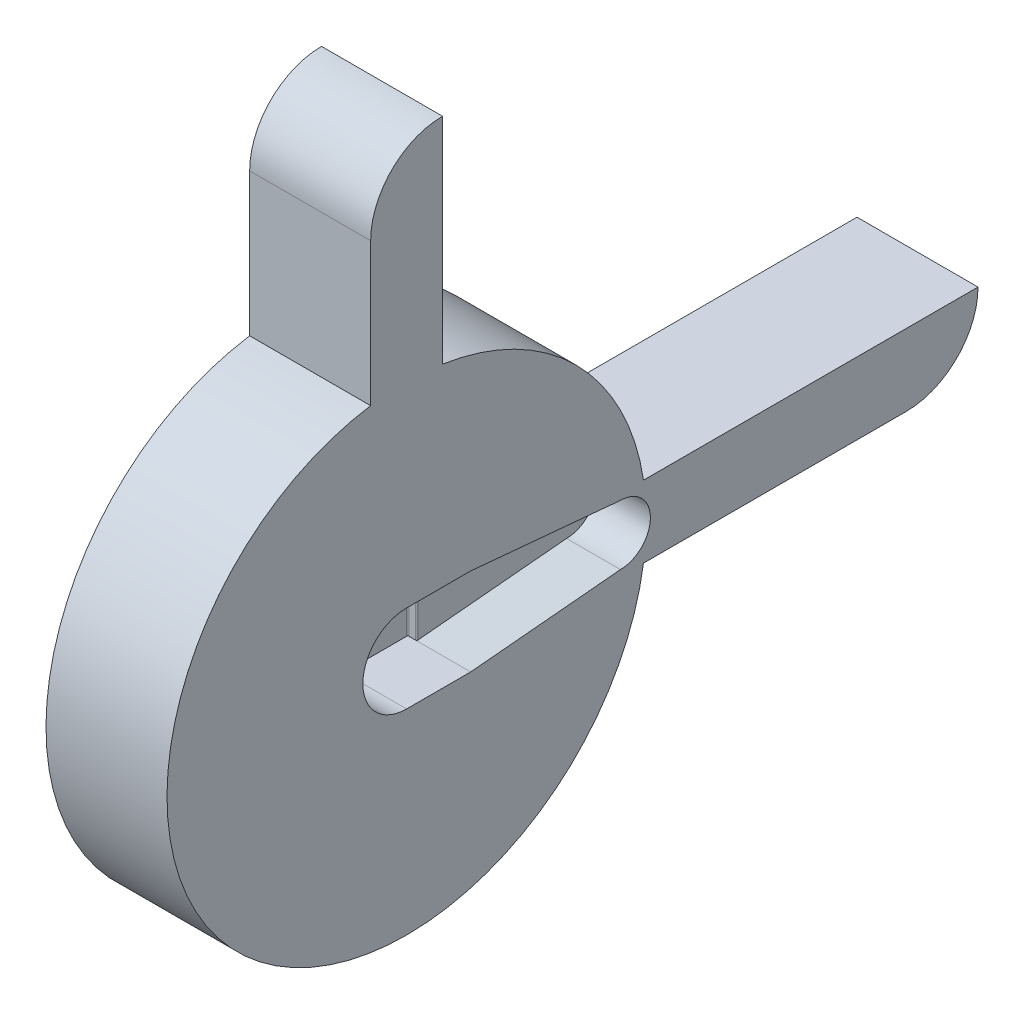
ISO-10303-21;
HEADER;
FILE_DESCRIPTION(('STEP AP214'),'2;1');
FILE_NAME('part.step','',(''),(''),'','','');
FILE_SCHEMA(('AUTOMOTIVE_DESIGN { 1 0 10303 214 1 1 1 1 }'));
ENDSEC;
DATA;
#1=APPLICATION_CONTEXT('core data for automotive mechanical design processes');
#2=APPLICATION_PROTOCOL_DEFINITION('international standard','automotive_design',2000,#1);
#3=PRODUCT_CONTEXT('',#1,'mechanical');
#4=PRODUCT('Part','Part','',(#3));
#5=PRODUCT_RELATED_PRODUCT_CATEGORY('part','',(#4));
#6=PRODUCT_DEFINITION_FORMATION('','',#4);
#7=PRODUCT_DEFINITION_CONTEXT('part definition',#1,'design');
#8=PRODUCT_DEFINITION('design','',#6,#7);
#9=PRODUCT_DEFINITION_SHAPE('','',#8);
#10=(LENGTH_UNIT() NAMED_UNIT(*) SI_UNIT(.MILLI.,.METRE.));
#11=(NAMED_UNIT(*) PLANE_ANGLE_UNIT() SI_UNIT($,.RADIAN.));
#12=(NAMED_UNIT(*) SI_UNIT($,.STERADIAN.) SOLID_ANGLE_UNIT());
#13=UNCERTAINTY_MEASURE_WITH_UNIT(LENGTH_MEASURE(1.E-05),#10,'distance_accuracy_value','');
#14=(GEOMETRIC_REPRESENTATION_CONTEXT(3) GLOBAL_UNCERTAINTY_ASSIGNED_CONTEXT((#13)) GLOBAL_UNIT_ASSIGNED_CONTEXT((#10,
#11,#12)) REPRESENTATION_CONTEXT('',''));
#15=CARTESIAN_POINT('',(0.,0.,0.));
#16=DIRECTION('',(0.,0.,1.));
#17=DIRECTION('',(1.,0.,0.));
#18=AXIS2_PLACEMENT_3D('',#15,#16,#17);
#19=CARTESIAN_POINT('',(4.75,0.,13.1498935704629));
#20=DIRECTION('',(0.,0.,1.));
#21=DIRECTION('',(1.,0.,0.));
#22=AXIS2_PLACEMENT_3D('',#19,#20,#21);
#23=PLANE('',#22);
#24=DIRECTION('',(1.,0.,0.));
#25=VECTOR('',#24,1.);
#26=CARTESIAN_POINT('',(4.75,58.3930013871417,13.1498935704629));
#27=LINE('',#26,#25);
#28=CARTESIAN_POINT('',(4.85,58.3930013871417,13.1498935704629));
#29=VERTEX_POINT('',#28);
#30=CARTESIAN_POINT('',(5.4,58.3930013871417,13.1498935704629));
#31=VERTEX_POINT('',#30);
#32=EDGE_CURVE('E239',#29,#31,#27,.T.);
#33=ORIENTED_EDGE('',*,*,#32,.T.);
#34=DIRECTION('',(0.,-1.,0.));
#35=VECTOR('',#34,1.);
#36=CARTESIAN_POINT('',(5.4,0.,13.1498935704629));
#37=LINE('',#36,#35);
#38=CARTESIAN_POINT('',(5.4,65.6930013871417,13.1498935704629));
#39=VERTEX_POINT('',#38);
#40=EDGE_CURVE('E292',#31,#39,#37,.F.);
#41=ORIENTED_EDGE('',*,*,#40,.T.);
#42=DIRECTION('',(1.,0.,0.));
#43=VECTOR('',#42,1.);
#44=CARTESIAN_POINT('',(4.75,65.6930013871417,13.1498935704629));
#45=LINE('',#44,#43);
#46=CARTESIAN_POINT('',(4.85,65.6930013871417,13.1498935704629));
#47=VERTEX_POINT('',#46);
#48=EDGE_CURVE('E235',#47,#39,#45,.T.);
#49=ORIENTED_EDGE('',*,*,#48,.F.);
#50=DIRECTION('',(0.,-1.,0.));
#51=VECTOR('',#50,1.);
#52=CARTESIAN_POINT('',(4.85,58.3930013871417,13.1498935704629));
#53=LINE('',#52,#51);
#54=EDGE_CURVE('E289',#47,#29,#53,.T.);
#55=ORIENTED_EDGE('',*,*,#54,.T.);
#56=EDGE_LOOP('',(#33,#41,#49,#55));
#57=FACE_BOUND('',#56,.T.);
#58=ADVANCED_FACE('F47',(#57),#23,.T.);
#59=CARTESIAN_POINT('',(10.,62.0430013861929,18.4998935714117));
#60=DIRECTION('',(1.,0.,0.));
#61=DIRECTION('',(0.,1.,0.));
#62=AXIS2_PLACEMENT_3D('',#59,#60,#61);
#63=PLANE('',#62);
#64=DIRECTION('',(0.,0.0916131102511358,-0.995794676642787));
#65=VECTOR('',#64,1.);
#66=CARTESIAN_POINT('',(10.,59.1025476324631,5.43743438218657));
#67=LINE('',#66,#65);
#68=CARTESIAN_POINT('',(10.,58.3930013871417,13.1498935704629));
#69=VERTEX_POINT('',#68);
#70=CARTESIAN_POINT('',(10.,59.5430013871417,0.649893570462901));
#71=VERTEX_POINT('',#70);
#72=EDGE_CURVE('E178',#69,#71,#67,.T.);
#73=ORIENTED_EDGE('',*,*,#72,.F.);
#74=DIRECTION('',(0.,0.,1.));
#75=VECTOR('',#74,1.);
#76=CARTESIAN_POINT('',(10.,58.3930013871417,0.));
#77=LINE('',#76,#75);
#78=CARTESIAN_POINT('',(10.,58.3930013871417,18.4998935704629));
#79=VERTEX_POINT('',#78);
#80=EDGE_CURVE('E219',#69,#79,#77,.T.);
#81=ORIENTED_EDGE('',*,*,#80,.T.);
#82=CARTESIAN_POINT('',(10.,62.0430013871417,18.4998935704629));
#83=DIRECTION('',(1.,0.,0.));
#84=DIRECTION('',(0.,0.,-1.));
#85=AXIS2_PLACEMENT_3D('',#82,#83,#84);
#86=CIRCLE('',#85,3.65);
#87=CARTESIAN_POINT('',(10.,65.6930013871417,18.4998935704629));
#88=VERTEX_POINT('',#87);
#89=EDGE_CURVE('E230',#88,#79,#86,.T.);
#90=ORIENTED_EDGE('',*,*,#89,.F.);
#91=DIRECTION('',(0.,0.,-1.));
#92=VECTOR('',#91,1.);
#93=CARTESIAN_POINT('',(10.,65.6930013871417,0.));
#94=LINE('',#93,#92);
#95=CARTESIAN_POINT('',(10.,65.6930013871417,13.1498935704629));
#96=VERTEX_POINT('',#95);
#97=EDGE_CURVE('E214',#88,#96,#94,.T.);
#98=ORIENTED_EDGE('',*,*,#97,.T.);
#99=DIRECTION('',(0.,-0.0916131102511363,-0.995794676642787));
#100=VECTOR('',#99,1.);
#101=CARTESIAN_POINT('',(10.,63.9420060395404,-5.88266455563771));
#102=LINE('',#101,#100);
#103=CARTESIAN_POINT('',(10.,64.5430013871417,0.649893570462901));
#104=VERTEX_POINT('',#103);
#105=EDGE_CURVE('E172',#96,#104,#102,.T.);
#106=ORIENTED_EDGE('',*,*,#105,.T.);
#107=CARTESIAN_POINT('',(10.,62.0430013871417,0.649893570462901));
#108=DIRECTION('',(1.,0.,0.));
#109=DIRECTION('',(0.,0.,-1.));
#110=AXIS2_PLACEMENT_3D('',#107,#108,#109);
#111=CIRCLE('',#110,2.5);
#112=EDGE_CURVE('E191',#71,#104,#111,.T.);
#113=ORIENTED_EDGE('',*,*,#112,.F.);
#114=EDGE_LOOP('',(#73,#81,#90,#98,#106,#113));
#115=FACE_BOUND('',#114,.T.);
#116=DIRECTION('',(0.,0.,1.));
#117=VECTOR('',#116,1.);
#118=CARTESIAN_POINT('',(10.,65.0430013871417,0.));
#119=LINE('',#118,#117);
#120=CARTESIAN_POINT('',(10.,65.0430013871417,-29.1970448862362));
#121=VERTEX_POINT('',#120);
#122=CARTESIAN_POINT('',(10.,65.0430013871417,-1.27382636282229));
#123=VERTEX_POINT('',#122);
#124=EDGE_CURVE('E254',#121,#123,#119,.T.);
#125=ORIENTED_EDGE('',*,*,#124,.T.);
#126=CARTESIAN_POINT('',(10.,62.0430013871417,18.4998935704629));
#127=DIRECTION('',(1.,0.,0.));
#128=DIRECTION('',(0.,0.,-1.));
#129=AXIS2_PLACEMENT_3D('',#126,#127,#128);
#130=CIRCLE('',#129,20.);
#131=CARTESIAN_POINT('',(10.,81.8167213204269,15.4998935704629));
#132=VERTEX_POINT('',#131);
#133=EDGE_CURVE('E196',#132,#123,#130,.F.);
#134=ORIENTED_EDGE('',*,*,#133,.F.);
#135=DIRECTION('',(0.,1.,0.));
#136=VECTOR('',#135,1.);
#137=CARTESIAN_POINT('',(10.,0.,15.4998935704629));
#138=LINE('',#137,#136);
#139=CARTESIAN_POINT('',(10.,99.7399398438408,15.4998935704629));
#140=VERTEX_POINT('',#139);
#141=EDGE_CURVE('E263',#132,#140,#138,.T.);
#142=ORIENTED_EDGE('',*,*,#141,.T.);
#143=CARTESIAN_POINT('',(10.,93.7399398438408,15.4998935704629));
#144=DIRECTION('',(1.,0.,0.));
#145=DIRECTION('',(0.,0.,-1.));
#146=AXIS2_PLACEMENT_3D('',#143,#144,#145);
#147=CIRCLE('',#146,6.);
#148=CARTESIAN_POINT('',(10.,93.7399398438408,21.4998935704629));
#149=VERTEX_POINT('',#148);
#150=EDGE_CURVE('E272',#140,#149,#147,.T.);
#151=ORIENTED_EDGE('',*,*,#150,.T.);
#152=DIRECTION('',(0.,1.,0.));
#153=VECTOR('',#152,1.);
#154=CARTESIAN_POINT('',(10.,0.,21.4998935704629));
#155=LINE('',#154,#153);
#156=CARTESIAN_POINT('',(10.,81.8167213204269,21.4998935704629));
#157=VERTEX_POINT('',#156);
#158=EDGE_CURVE('E275',#157,#149,#155,.T.);
#159=ORIENTED_EDGE('',*,*,#158,.F.);
#160=CARTESIAN_POINT('',(10.,59.0430013871417,-1.2738263628223));
#161=VERTEX_POINT('',#160);
#162=EDGE_CURVE('E205',#161,#157,#130,.F.);
#163=ORIENTED_EDGE('',*,*,#162,.F.);
#164=DIRECTION('',(0.,0.,1.));
#165=VECTOR('',#164,1.);
#166=CARTESIAN_POINT('',(10.,59.0430013871417,0.));
#167=LINE('',#166,#165);
#168=CARTESIAN_POINT('',(10.,59.0430013871417,-23.1970448862362));
#169=VERTEX_POINT('',#168);
#170=EDGE_CURVE('E257',#169,#161,#167,.T.);
#171=ORIENTED_EDGE('',*,*,#170,.F.);
#172=CARTESIAN_POINT('',(10.,65.0430013871417,-23.1970448862362));
#173=DIRECTION('',(1.,0.,0.));
#174=DIRECTION('',(0.,0.,-1.));
#175=AXIS2_PLACEMENT_3D('',#172,#173,#174);
#176=CIRCLE('',#175,6.00000000000001);
#177=EDGE_CURVE('E238',#121,#169,#176,.F.);
#178=ORIENTED_EDGE('',*,*,#177,.F.);
#179=EDGE_LOOP('',(#125,#134,#142,#151,#159,#163,#171,#178));
#180=FACE_BOUND('',#179,.T.);
#181=ADVANCED_FACE('F324',(#115,#180),#63,.T.);
#182=CARTESIAN_POINT('',(10.,62.0430013871417,18.4998935704629));
#183=DIRECTION('',(-1.,0.,0.));
#184=DIRECTION('',(0.,0.,1.));
#185=AXIS2_PLACEMENT_3D('',#182,#183,#184);
#186=CYLINDRICAL_SURFACE('',#185,1.25);
#187=CARTESIAN_POINT('',(-0.1,62.0430013871417,18.4998935704629));
#188=DIRECTION('',(-1.,0.,0.));
#189=DIRECTION('',(0.,0.,1.));
#190=AXIS2_PLACEMENT_3D('',#187,#188,#189);
#191=CIRCLE('',#190,1.25);
#192=CARTESIAN_POINT('',(-0.1,62.0430013871417,19.7498935704629));
#193=VERTEX_POINT('',#192);
#194=EDGE_CURVE('E283',#193,#193,#191,.T.);
#195=ORIENTED_EDGE('',*,*,#194,.T.);
#196=EDGE_LOOP('',(#195));
#197=FACE_BOUND('',#196,.T.);
#198=CARTESIAN_POINT('',(4.75,62.0430013871417,18.4998935704629));
#199=DIRECTION('',(1.,0.,0.));
#200=DIRECTION('',(0.,0.,-1.));
#201=AXIS2_PLACEMENT_3D('',#198,#199,#200);
#202=CIRCLE('',#201,1.25);
#203=CARTESIAN_POINT('',(4.75,62.0430013871417,17.2498935704629));
#204=VERTEX_POINT('',#203);
#205=EDGE_CURVE('E215',#204,#204,#202,.F.);
#206=ORIENTED_EDGE('',*,*,#205,.F.);
#207=EDGE_LOOP('',(#206));
#208=FACE_BOUND('',#207,.T.);
#209=ADVANCED_FACE('F343',(#197,#208),#186,.F.);
#210=CARTESIAN_POINT('',(-0.1,62.0430013861929,18.4998935714117));
#211=DIRECTION('',(1.,0.,0.));
#212=DIRECTION('',(0.,1.,0.));
#213=AXIS2_PLACEMENT_3D('',#210,#211,#212);
#214=PLANE('',#213);
#215=DIRECTION('',(0.,0.,-1.));
#216=VECTOR('',#215,1.);
#217=CARTESIAN_POINT('',(-0.100000000000003,59.0430013871417,0.));
#218=LINE('',#217,#216);
#219=CARTESIAN_POINT('',(-0.100000000000003,59.0430013871417,-1.2738263628223));
#220=VERTEX_POINT('',#219);
#221=CARTESIAN_POINT('',(-0.100000000000003,59.0430013871417,-23.1970448862362));
#222=VERTEX_POINT('',#221);
#223=EDGE_CURVE('E245',#220,#222,#218,.T.);
#224=ORIENTED_EDGE('',*,*,#223,.F.);
#225=CARTESIAN_POINT('',(-0.1,62.0430013871417,18.4998935704629));
#226=DIRECTION('',(-1.,0.,0.));
#227=DIRECTION('',(0.,0.,1.));
#228=AXIS2_PLACEMENT_3D('',#225,#226,#227);
#229=CIRCLE('',#228,20.);
#230=CARTESIAN_POINT('',(-0.100000000000003,81.8167213204269,21.4998935704629));
#231=VERTEX_POINT('',#230);
#232=EDGE_CURVE('E201',#220,#231,#229,.T.);
#233=ORIENTED_EDGE('',*,*,#232,.T.);
#234=DIRECTION('',(0.,-1.,0.));
#235=VECTOR('',#234,1.);
#236=CARTESIAN_POINT('',(-0.100000000000003,0.,21.4998935704629));
#237=LINE('',#236,#235);
#238=CARTESIAN_POINT('',(-0.100000000000003,93.7399398438408,21.4998935704629));
#239=VERTEX_POINT('',#238);
#240=EDGE_CURVE('E264',#239,#231,#237,.T.);
#241=ORIENTED_EDGE('',*,*,#240,.F.);
#242=CARTESIAN_POINT('',(-0.100000000000003,93.7399398438408,15.4998935704629));
#243=DIRECTION('',(1.,0.,0.));
#244=DIRECTION('',(0.,0.,-1.));
#245=AXIS2_PLACEMENT_3D('',#242,#243,#244);
#246=CIRCLE('',#245,6.);
#247=CARTESIAN_POINT('',(-0.100000000000003,99.7399398438408,15.4998935704629));
#248=VERTEX_POINT('',#247);
#249=EDGE_CURVE('E270',#239,#248,#246,.F.);
#250=ORIENTED_EDGE('',*,*,#249,.T.);
#251=DIRECTION('',(0.,-1.,0.));
#252=VECTOR('',#251,1.);
#253=CARTESIAN_POINT('',(-0.100000000000003,0.,15.4998935704629));
#254=LINE('',#253,#252);
#255=CARTESIAN_POINT('',(-0.1,81.8167213204269,15.4998935704629));
#256=VERTEX_POINT('',#255);
#257=EDGE_CURVE('E266',#248,#256,#254,.T.);
#258=ORIENTED_EDGE('',*,*,#257,.T.);
#259=CARTESIAN_POINT('',(-0.1,65.0430013871417,-1.27382636282229));
#260=VERTEX_POINT('',#259);
#261=EDGE_CURVE('E204',#256,#260,#229,.T.);
#262=ORIENTED_EDGE('',*,*,#261,.T.);
#263=DIRECTION('',(0.,0.,-1.));
#264=VECTOR('',#263,1.);
#265=CARTESIAN_POINT('',(-0.100000000000003,65.0430013871417,0.));
#266=LINE('',#265,#264);
#267=CARTESIAN_POINT('',(-0.100000000000003,65.0430013871417,-29.1970448862362));
#268=VERTEX_POINT('',#267);
#269=EDGE_CURVE('E251',#260,#268,#266,.T.);
#270=ORIENTED_EDGE('',*,*,#269,.T.);
#271=CARTESIAN_POINT('',(-0.100000000000003,65.0430013871417,-23.1970448862362));
#272=DIRECTION('',(1.,0.,0.));
#273=DIRECTION('',(0.,0.,-1.));
#274=AXIS2_PLACEMENT_3D('',#271,#272,#273);
#275=CIRCLE('',#274,6.00000000000001);
#276=EDGE_CURVE('E247',#222,#268,#275,.T.);
#277=ORIENTED_EDGE('',*,*,#276,.F.);
#278=EDGE_LOOP('',(#224,#233,#241,#250,#258,#262,#270,#277));
#279=FACE_BOUND('',#278,.T.);
#280=ORIENTED_EDGE('',*,*,#194,.F.);
#281=EDGE_LOOP('',(#280));
#282=FACE_BOUND('',#281,.T.);
#283=ADVANCED_FACE('F377',(#279,#282),#214,.F.);
#284=CARTESIAN_POINT('',(-33.6410196624969,0.,15.4998935704629));
#285=DIRECTION('',(0.,0.,-1.));
#286=DIRECTION('',(-1.,0.,0.));
#287=AXIS2_PLACEMENT_3D('',#284,#285,#286);
#288=PLANE('',#287);
#289=DIRECTION('',(-1.,0.,0.));
#290=VECTOR('',#289,1.);
#291=CARTESIAN_POINT('',(66.5685424949238,81.8167213204269,15.4998935704629));
#292=LINE('',#291,#290);
#293=EDGE_CURVE('E212',#256,#132,#292,.F.);
#294=ORIENTED_EDGE('',*,*,#293,.F.);
#295=ORIENTED_EDGE('',*,*,#257,.F.);
#296=DIRECTION('',(1.,0.,0.));
#297=VECTOR('',#296,1.);
#298=CARTESIAN_POINT('',(-33.6410196624969,99.7399398438408,15.4998935704629));
#299=LINE('',#298,#297);
#300=EDGE_CURVE('E277',#248,#140,#299,.T.);
#301=ORIENTED_EDGE('',*,*,#300,.T.);
#302=ORIENTED_EDGE('',*,*,#141,.F.);
#303=EDGE_LOOP('',(#294,#295,#301,#302));
#304=FACE_BOUND('',#303,.T.);
#305=ADVANCED_FACE('F370',(#304),#288,.T.);
#306=CARTESIAN_POINT('',(-33.6410196624969,0.,21.4998935704629));
#307=DIRECTION('',(0.,0.,-1.));
#308=DIRECTION('',(-1.,0.,0.));
#309=AXIS2_PLACEMENT_3D('',#306,#307,#308);
#310=PLANE('',#309);
#311=ORIENTED_EDGE('',*,*,#240,.T.);
#312=DIRECTION('',(-1.,0.,0.));
#313=VECTOR('',#312,1.);
#314=CARTESIAN_POINT('',(66.5685424949238,81.8167213204269,21.4998935704629));
#315=LINE('',#314,#313);
#316=EDGE_CURVE('E210',#231,#157,#315,.F.);
#317=ORIENTED_EDGE('',*,*,#316,.T.);
#318=ORIENTED_EDGE('',*,*,#158,.T.);
#319=DIRECTION('',(1.,0.,0.));
#320=VECTOR('',#319,1.);
#321=CARTESIAN_POINT('',(-33.6410196624969,93.7399398438408,21.4998935704629));
#322=LINE('',#321,#320);
#323=EDGE_CURVE('E267',#239,#149,#322,.T.);
#324=ORIENTED_EDGE('',*,*,#323,.F.);
#325=EDGE_LOOP('',(#311,#317,#318,#324));
#326=FACE_BOUND('',#325,.T.);
#327=ADVANCED_FACE('F367',(#326),#310,.F.);
#328=CARTESIAN_POINT('',(-33.6410196624969,93.7399398438408,15.4998935704629));
#329=DIRECTION('',(1.,0.,0.));
#330=DIRECTION('',(0.,0.,-1.));
#331=AXIS2_PLACEMENT_3D('',#328,#329,#330);
#332=CYLINDRICAL_SURFACE('',#331,6.);
#333=ORIENTED_EDGE('',*,*,#249,.F.);
#334=ORIENTED_EDGE('',*,*,#323,.T.);
#335=ORIENTED_EDGE('',*,*,#150,.F.);
#336=ORIENTED_EDGE('',*,*,#300,.F.);
#337=EDGE_LOOP('',(#333,#334,#335,#336));
#338=FACE_BOUND('',#337,.T.);
#339=ADVANCED_FACE('F365',(#338),#332,.T.);
#340=CARTESIAN_POINT('',(-33.6410196624969,65.0430013871417,-23.1970448862362));
#341=DIRECTION('',(1.,0.,0.));
#342=DIRECTION('',(0.,0.,-1.));
#343=AXIS2_PLACEMENT_3D('',#340,#341,#342);
#344=CYLINDRICAL_SURFACE('',#343,6.00000000000001);
#345=DIRECTION('',(1.,0.,0.));
#346=VECTOR('',#345,1.);
#347=CARTESIAN_POINT('',(-33.6410196624969,59.0430013871417,-23.1970448862362));
#348=LINE('',#347,#346);
#349=EDGE_CURVE('E248',#222,#169,#348,.T.);
#350=ORIENTED_EDGE('',*,*,#349,.F.);
#351=ORIENTED_EDGE('',*,*,#276,.T.);
#352=DIRECTION('',(1.,0.,0.));
#353=VECTOR('',#352,1.);
#354=CARTESIAN_POINT('',(-33.6410196624969,65.0430013871417,-29.1970448862362));
#355=LINE('',#354,#353);
#356=EDGE_CURVE('E259',#268,#121,#355,.T.);
#357=ORIENTED_EDGE('',*,*,#356,.T.);
#358=ORIENTED_EDGE('',*,*,#177,.T.);
#359=EDGE_LOOP('',(#350,#351,#357,#358));
#360=FACE_BOUND('',#359,.T.);
#361=ADVANCED_FACE('F358',(#360),#344,.T.);
#362=CARTESIAN_POINT('',(-33.6410196624969,59.0430013871417,0.));
#363=DIRECTION('',(0.,1.,0.));
#364=DIRECTION('',(0.,0.,1.));
#365=AXIS2_PLACEMENT_3D('',#362,#363,#364);
#366=PLANE('',#365);
#367=ORIENTED_EDGE('',*,*,#170,.T.);
#368=DIRECTION('',(-1.,0.,0.));
#369=VECTOR('',#368,1.);
#370=CARTESIAN_POINT('',(66.5685424949238,59.0430013871417,-1.2738263628223));
#371=LINE('',#370,#369);
#372=EDGE_CURVE('E208',#161,#220,#371,.T.);
#373=ORIENTED_EDGE('',*,*,#372,.T.);
#374=ORIENTED_EDGE('',*,*,#223,.T.);
#375=ORIENTED_EDGE('',*,*,#349,.T.);
#376=EDGE_LOOP('',(#367,#373,#374,#375));
#377=FACE_BOUND('',#376,.T.);
#378=ADVANCED_FACE('F355',(#377),#366,.F.);
#379=CARTESIAN_POINT('',(-33.6410196624969,65.0430013871417,0.));
#380=DIRECTION('',(0.,1.,0.));
#381=DIRECTION('',(0.,0.,1.));
#382=AXIS2_PLACEMENT_3D('',#379,#380,#381);
#383=PLANE('',#382);
#384=DIRECTION('',(-1.,0.,0.));
#385=VECTOR('',#384,1.);
#386=CARTESIAN_POINT('',(66.5685424949238,65.0430013871417,-1.27382636282229));
#387=LINE('',#386,#385);
#388=EDGE_CURVE('E286',#123,#260,#387,.T.);
#389=ORIENTED_EDGE('',*,*,#388,.F.);
#390=ORIENTED_EDGE('',*,*,#124,.F.);
#391=ORIENTED_EDGE('',*,*,#356,.F.);
#392=ORIENTED_EDGE('',*,*,#269,.F.);
#393=EDGE_LOOP('',(#389,#390,#391,#392));
#394=FACE_BOUND('',#393,.T.);
#395=ADVANCED_FACE('F354',(#394),#383,.T.);
#396=CARTESIAN_POINT('',(4.75,65.6930013871417,0.));
#397=DIRECTION('',(0.,-1.,0.));
#398=DIRECTION('',(0.,0.,-1.));
#399=AXIS2_PLACEMENT_3D('',#396,#397,#398);
#400=PLANE('',#399);
#401=DIRECTION('',(0.,0.,-1.));
#402=VECTOR('',#401,1.);
#403=CARTESIAN_POINT('',(4.75,65.6930013871417,0.));
#404=LINE('',#403,#402);
#405=CARTESIAN_POINT('',(4.75,65.6930013871417,18.4998935704629));
#406=VERTEX_POINT('',#405);
#407=CARTESIAN_POINT('',(4.75,65.6930013871417,13.2498935704629));
#408=VERTEX_POINT('',#407);
#409=EDGE_CURVE('E218',#406,#408,#404,.T.);
#410=ORIENTED_EDGE('',*,*,#409,.T.);
#411=CARTESIAN_POINT('',(4.85,65.6930013871417,13.2498935704629));
#412=DIRECTION('',(0.,-1.,0.));
#413=DIRECTION('',(0.,0.,-1.));
#414=AXIS2_PLACEMENT_3D('',#411,#412,#413);
#415=CIRCLE('',#414,0.1);
#416=EDGE_CURVE('E299',#408,#47,#415,.T.);
#417=ORIENTED_EDGE('',*,*,#416,.T.);
#418=ORIENTED_EDGE('',*,*,#48,.T.);
#419=DIRECTION('',(1.,0.,0.));
#420=VECTOR('',#419,1.);
#421=CARTESIAN_POINT('',(5.5,65.6930013871417,13.1498935704629));
#422=LINE('',#421,#420);
#423=EDGE_CURVE('E197',#39,#96,#422,.T.);
#424=ORIENTED_EDGE('',*,*,#423,.T.);
#425=ORIENTED_EDGE('',*,*,#97,.F.);
#426=DIRECTION('',(1.,0.,0.));
#427=VECTOR('',#426,1.);
#428=CARTESIAN_POINT('',(4.75,65.6930013871417,18.4998935704629));
#429=LINE('',#428,#427);
#430=EDGE_CURVE('E227',#406,#88,#429,.T.);
#431=ORIENTED_EDGE('',*,*,#430,.F.);
#432=EDGE_LOOP('',(#410,#417,#418,#424,#425,#431));
#433=FACE_BOUND('',#432,.T.);
#434=ADVANCED_FACE('F309',(#433),#400,.T.);
#435=CARTESIAN_POINT('',(4.75,58.3930013871417,0.));
#436=DIRECTION('',(0.,1.,0.));
#437=DIRECTION('',(0.,0.,1.));
#438=AXIS2_PLACEMENT_3D('',#435,#436,#437);
#439=PLANE('',#438);
#440=ORIENTED_EDGE('',*,*,#32,.F.);
#441=CARTESIAN_POINT('',(4.85,58.3930013871417,13.2498935704629));
#442=DIRECTION('',(0.,1.,0.));
#443=DIRECTION('',(0.,0.,1.));
#444=AXIS2_PLACEMENT_3D('',#441,#442,#443);
#445=CIRCLE('',#444,0.1);
#446=CARTESIAN_POINT('',(4.75,58.3930013871417,13.2498935704629));
#447=VERTEX_POINT('',#446);
#448=EDGE_CURVE('E295',#29,#447,#445,.T.);
#449=ORIENTED_EDGE('',*,*,#448,.T.);
#450=DIRECTION('',(0.,0.,1.));
#451=VECTOR('',#450,1.);
#452=CARTESIAN_POINT('',(4.75,58.3930013871417,0.));
#453=LINE('',#452,#451);
#454=CARTESIAN_POINT('',(4.75,58.3930013871417,18.4998935704629));
#455=VERTEX_POINT('',#454);
#456=EDGE_CURVE('E225',#447,#455,#453,.T.);
#457=ORIENTED_EDGE('',*,*,#456,.T.);
#458=DIRECTION('',(1.,0.,0.));
#459=VECTOR('',#458,1.);
#460=CARTESIAN_POINT('',(4.75,58.3930013871417,18.4998935704629));
#461=LINE('',#460,#459);
#462=EDGE_CURVE('E241',#455,#79,#461,.T.);
#463=ORIENTED_EDGE('',*,*,#462,.T.);
#464=ORIENTED_EDGE('',*,*,#80,.F.);
#465=DIRECTION('',(1.,0.,0.));
#466=VECTOR('',#465,1.);
#467=CARTESIAN_POINT('',(5.5,58.3930013871417,13.1498935704629));
#468=LINE('',#467,#466);
#469=EDGE_CURVE('E63',#31,#69,#468,.T.);
#470=ORIENTED_EDGE('',*,*,#469,.F.);
#471=EDGE_LOOP('',(#440,#449,#457,#463,#464,#470));
#472=FACE_BOUND('',#471,.T.);
#473=ADVANCED_FACE('F314',(#472),#439,.T.);
#474=CARTESIAN_POINT('',(4.75,62.0430013871417,18.4998935704629));
#475=DIRECTION('',(1.,0.,0.));
#476=DIRECTION('',(0.,0.,-1.));
#477=AXIS2_PLACEMENT_3D('',#474,#475,#476);
#478=CYLINDRICAL_SURFACE('',#477,3.65);
#479=ORIENTED_EDGE('',*,*,#89,.T.);
#480=ORIENTED_EDGE('',*,*,#462,.F.);
#481=CARTESIAN_POINT('',(4.75,62.0430013871417,18.4998935704629));
#482=DIRECTION('',(1.,0.,0.));
#483=DIRECTION('',(0.,0.,-1.));
#484=AXIS2_PLACEMENT_3D('',#481,#482,#483);
#485=CIRCLE('',#484,3.65);
#486=EDGE_CURVE('E222',#406,#455,#485,.T.);
#487=ORIENTED_EDGE('',*,*,#486,.F.);
#488=ORIENTED_EDGE('',*,*,#430,.T.);
#489=EDGE_LOOP('',(#479,#480,#487,#488));
#490=FACE_BOUND('',#489,.T.);
#491=ADVANCED_FACE('F321',(#490),#478,.F.);
#492=CARTESIAN_POINT('',(4.75,0.,0.));
#493=DIRECTION('',(1.,0.,0.));
#494=DIRECTION('',(0.,0.,-1.));
#495=AXIS2_PLACEMENT_3D('',#492,#493,#494);
#496=PLANE('',#495);
#497=ORIENTED_EDGE('',*,*,#205,.T.);
#498=EDGE_LOOP('',(#497));
#499=FACE_BOUND('',#498,.T.);
#500=ORIENTED_EDGE('',*,*,#456,.F.);
#501=DIRECTION('',(0.,-1.,0.));
#502=VECTOR('',#501,1.);
#503=CARTESIAN_POINT('',(4.75,65.6930013871417,13.2498935704629));
#504=LINE('',#503,#502);
#505=EDGE_CURVE('E297',#447,#408,#504,.F.);
#506=ORIENTED_EDGE('',*,*,#505,.T.);
#507=ORIENTED_EDGE('',*,*,#409,.F.);
#508=ORIENTED_EDGE('',*,*,#486,.T.);
#509=EDGE_LOOP('',(#500,#506,#507,#508));
#510=FACE_BOUND('',#509,.T.);
#511=ADVANCED_FACE('F318',(#499,#510),#496,.T.);
#512=CARTESIAN_POINT('',(66.5685424949238,62.0430013871417,18.4998935704629));
#513=DIRECTION('',(-1.,0.,0.));
#514=DIRECTION('',(0.,0.,1.));
#515=AXIS2_PLACEMENT_3D('',#512,#513,#514);
#516=CYLINDRICAL_SURFACE('',#515,20.);
#517=ORIENTED_EDGE('',*,*,#261,.F.);
#518=ORIENTED_EDGE('',*,*,#293,.T.);
#519=ORIENTED_EDGE('',*,*,#133,.T.);
#520=ORIENTED_EDGE('',*,*,#388,.T.);
#521=EDGE_LOOP('',(#517,#518,#519,#520));
#522=FACE_BOUND('',#521,.T.);
#523=ADVANCED_FACE('F417',(#522),#516,.T.);
#524=ORIENTED_EDGE('',*,*,#316,.F.);
#525=ORIENTED_EDGE('',*,*,#232,.F.);
#526=ORIENTED_EDGE('',*,*,#372,.F.);
#527=ORIENTED_EDGE('',*,*,#162,.T.);
#528=EDGE_LOOP('',(#524,#525,#526,#527));
#529=FACE_BOUND('',#528,.T.);
#530=ADVANCED_FACE('F335',(#529),#516,.T.);
#531=CARTESIAN_POINT('',(5.5,59.1025476324631,5.43743438218657));
#532=DIRECTION('',(0.,-0.995794676642787,-0.0916131102511357));
#533=DIRECTION('',(0.,0.0916131102511358,-0.995794676642787));
#534=AXIS2_PLACEMENT_3D('',#531,#532,#533);
#535=PLANE('',#534);
#536=ORIENTED_EDGE('',*,*,#72,.T.);
#537=DIRECTION('',(1.,0.,0.));
#538=VECTOR('',#537,1.);
#539=CARTESIAN_POINT('',(5.5,59.5430013871417,0.649893570462901));
#540=LINE('',#539,#538);
#541=CARTESIAN_POINT('',(5.5,59.5430013871417,0.649893570462901));
#542=VERTEX_POINT('',#541);
#543=EDGE_CURVE('E175',#542,#71,#540,.T.);
#544=ORIENTED_EDGE('',*,*,#543,.F.);
#545=DIRECTION('',(0.,0.0916131102511358,-0.995794676642787));
#546=VECTOR('',#545,1.);
#547=CARTESIAN_POINT('',(5.5,59.1025476324631,5.43743438218657));
#548=LINE('',#547,#546);
#549=CARTESIAN_POINT('',(5.5,58.4022013871417,13.0498935704629));
#550=VERTEX_POINT('',#549);
#551=EDGE_CURVE('E162',#550,#542,#548,.T.);
#552=ORIENTED_EDGE('',*,*,#551,.F.);
#553=CARTESIAN_POINT('',(5.4,58.4022013871417,13.0498935704629));
#554=DIRECTION('',(0.,-0.995794676642787,-0.0916131102511357));
#555=DIRECTION('',(0.,-0.0916131102511358,0.995794676642787));
#556=AXIS2_PLACEMENT_3D('',#553,#554,#555);
#557=ELLIPSE('',#556,0.100422308278589,0.1);
#558=EDGE_CURVE('E56',#550,#31,#557,.T.);
#559=ORIENTED_EDGE('',*,*,#558,.T.);
#560=ORIENTED_EDGE('',*,*,#469,.T.);
#561=EDGE_LOOP('',(#536,#544,#552,#559,#560));
#562=FACE_BOUND('',#561,.T.);
#563=ADVANCED_FACE('F176',(#562),#535,.F.);
#564=CARTESIAN_POINT('',(5.5,63.9420060395404,-5.88266455563771));
#565=DIRECTION('',(0.,-0.995794676642787,0.0916131102511363));
#566=DIRECTION('',(0.,-0.0916131102511363,-0.995794676642787));
#567=AXIS2_PLACEMENT_3D('',#564,#565,#566);
#568=PLANE('',#567);
#569=ORIENTED_EDGE('',*,*,#105,.F.);
#570=ORIENTED_EDGE('',*,*,#423,.F.);
#571=CARTESIAN_POINT('',(5.4,65.6838013871417,13.0498935704629));
#572=DIRECTION('',(0.,-0.995794676642787,0.0916131102511363));
#573=DIRECTION('',(0.,-0.0916131102511363,-0.995794676642787));
#574=AXIS2_PLACEMENT_3D('',#571,#572,#573);
#575=ELLIPSE('',#574,0.100422308278589,0.1);
#576=CARTESIAN_POINT('',(5.5,65.6838013871417,13.0498935704629));
#577=VERTEX_POINT('',#576);
#578=EDGE_CURVE('E11',#39,#577,#575,.F.);
#579=ORIENTED_EDGE('',*,*,#578,.T.);
#580=DIRECTION('',(0.,-0.0916131102511363,-0.995794676642787));
#581=VECTOR('',#580,1.);
#582=CARTESIAN_POINT('',(5.5,63.9420060395404,-5.88266455563771));
#583=LINE('',#582,#581);
#584=CARTESIAN_POINT('',(5.5,64.5430013871417,0.649893570462901));
#585=VERTEX_POINT('',#584);
#586=EDGE_CURVE('E183',#577,#585,#583,.T.);
#587=ORIENTED_EDGE('',*,*,#586,.T.);
#588=DIRECTION('',(1.,0.,0.));
#589=VECTOR('',#588,1.);
#590=CARTESIAN_POINT('',(5.5,64.5430013871417,0.649893570462901));
#591=LINE('',#590,#589);
#592=EDGE_CURVE('E182',#585,#104,#591,.T.);
#593=ORIENTED_EDGE('',*,*,#592,.T.);
#594=EDGE_LOOP('',(#569,#570,#579,#587,#593));
#595=FACE_BOUND('',#594,.T.);
#596=ADVANCED_FACE('F327',(#595),#568,.T.);
#597=CARTESIAN_POINT('',(5.5,62.0430013871417,0.649893570462901));
#598=DIRECTION('',(1.,0.,0.));
#599=DIRECTION('',(0.,0.,-1.));
#600=AXIS2_PLACEMENT_3D('',#597,#598,#599);
#601=CYLINDRICAL_SURFACE('',#600,2.5);
#602=ORIENTED_EDGE('',*,*,#112,.T.);
#603=ORIENTED_EDGE('',*,*,#592,.F.);
#604=CARTESIAN_POINT('',(5.5,62.0430013871417,0.649893570462901));
#605=DIRECTION('',(1.,0.,0.));
#606=DIRECTION('',(0.,0.,-1.));
#607=AXIS2_PLACEMENT_3D('',#604,#605,#606);
#608=CIRCLE('',#607,2.5);
#609=EDGE_CURVE('E167',#542,#585,#608,.T.);
#610=ORIENTED_EDGE('',*,*,#609,.F.);
#611=ORIENTED_EDGE('',*,*,#543,.T.);
#612=EDGE_LOOP('',(#602,#603,#610,#611));
#613=FACE_BOUND('',#612,.T.);
#614=ADVANCED_FACE('F186',(#613),#601,.F.);
#615=CARTESIAN_POINT('',(5.5,0.,0.));
#616=DIRECTION('',(1.,0.,0.));
#617=DIRECTION('',(0.,0.,-1.));
#618=AXIS2_PLACEMENT_3D('',#615,#616,#617);
#619=PLANE('',#618);
#620=ORIENTED_EDGE('',*,*,#586,.F.);
#621=DIRECTION('',(0.,-1.,0.));
#622=VECTOR('',#621,1.);
#623=CARTESIAN_POINT('',(5.5,0.,13.0498935704629));
#624=LINE('',#623,#622);
#625=EDGE_CURVE('E169',#577,#550,#624,.T.);
#626=ORIENTED_EDGE('',*,*,#625,.T.);
#627=ORIENTED_EDGE('',*,*,#551,.T.);
#628=ORIENTED_EDGE('',*,*,#609,.T.);
#629=EDGE_LOOP('',(#620,#626,#627,#628));
#630=FACE_BOUND('',#629,.T.);
#631=ADVANCED_FACE('F165',(#630),#619,.T.);
#632=CARTESIAN_POINT('',(5.4,0.,13.0498935704629));
#633=DIRECTION('',(0.,-1.,0.));
#634=DIRECTION('',(0.,0.,-1.));
#635=AXIS2_PLACEMENT_3D('',#632,#633,#634);
#636=CYLINDRICAL_SURFACE('',#635,0.1);
#637=ORIENTED_EDGE('',*,*,#578,.F.);
#638=ORIENTED_EDGE('',*,*,#40,.F.);
#639=ORIENTED_EDGE('',*,*,#558,.F.);
#640=ORIENTED_EDGE('',*,*,#625,.F.);
#641=EDGE_LOOP('',(#637,#638,#639,#640));
#642=FACE_BOUND('',#641,.T.);
#643=ADVANCED_FACE('F303',(#642),#636,.T.);
#644=CARTESIAN_POINT('',(4.85,0.,13.2498935704629));
#645=DIRECTION('',(0.,1.,0.));
#646=DIRECTION('',(0.,0.,1.));
#647=AXIS2_PLACEMENT_3D('',#644,#645,#646);
#648=CYLINDRICAL_SURFACE('',#647,0.1);
#649=ORIENTED_EDGE('',*,*,#416,.F.);
#650=ORIENTED_EDGE('',*,*,#505,.F.);
#651=ORIENTED_EDGE('',*,*,#448,.F.);
#652=ORIENTED_EDGE('',*,*,#54,.F.);
#653=EDGE_LOOP('',(#649,#650,#651,#652));
#654=FACE_BOUND('',#653,.T.);
#655=ADVANCED_FACE('F49',(#654),#648,.F.);
#656=CLOSED_SHELL('',(#58,#181,#209,#283,#305,#327,#339,#361,#378,#395,#434,#473,#491,#511,#523,
#530,#563,#596,#614,#631,#643,#655));
#657=MANIFOLD_SOLID_BREP('B2',#656);
#658=ADVANCED_BREP_SHAPE_REPRESENTATION('',(#18,#657),#14);
#659=SHAPE_DEFINITION_REPRESENTATION(#9,#658);
ENDSEC;
END-ISO-10303-21;
